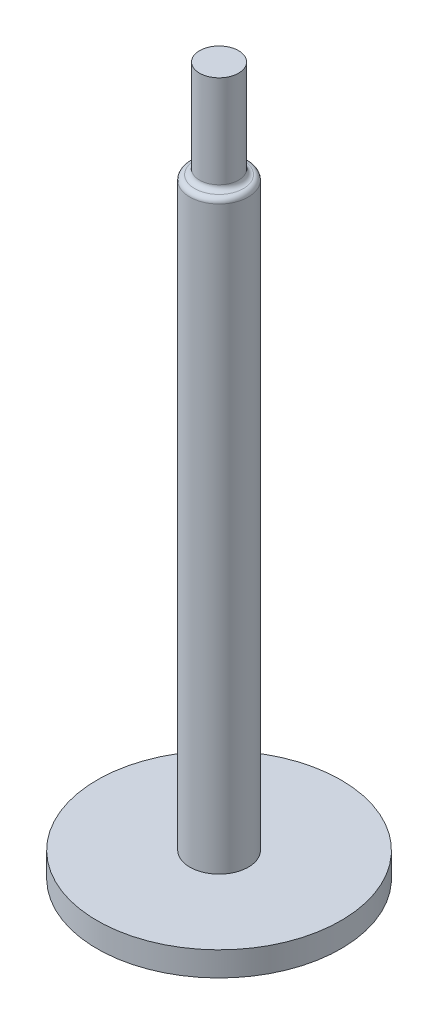
ISO-10303-21;
HEADER;
FILE_DESCRIPTION(('STEP AP214'),'2;1');
FILE_NAME('part.step','',(''),(''),'','','');
FILE_SCHEMA(('AUTOMOTIVE_DESIGN { 1 0 10303 214 1 1 1 1 }'));
ENDSEC;
DATA;
#1=APPLICATION_CONTEXT('core data for automotive mechanical design processes');
#2=APPLICATION_PROTOCOL_DEFINITION('international standard','automotive_design',2000,#1);
#3=PRODUCT_CONTEXT('',#1,'mechanical');
#4=PRODUCT('Part','Part','',(#3));
#5=PRODUCT_RELATED_PRODUCT_CATEGORY('part','',(#4));
#6=PRODUCT_DEFINITION_FORMATION('','',#4);
#7=PRODUCT_DEFINITION_CONTEXT('part definition',#1,'design');
#8=PRODUCT_DEFINITION('design','',#6,#7);
#9=PRODUCT_DEFINITION_SHAPE('','',#8);
#10=(LENGTH_UNIT() NAMED_UNIT(*) SI_UNIT(.MILLI.,.METRE.));
#11=(NAMED_UNIT(*) PLANE_ANGLE_UNIT() SI_UNIT($,.RADIAN.));
#12=(NAMED_UNIT(*) SI_UNIT($,.STERADIAN.) SOLID_ANGLE_UNIT());
#13=UNCERTAINTY_MEASURE_WITH_UNIT(LENGTH_MEASURE(1.E-05),#10,'distance_accuracy_value','');
#14=(GEOMETRIC_REPRESENTATION_CONTEXT(3) GLOBAL_UNCERTAINTY_ASSIGNED_CONTEXT((#13)) GLOBAL_UNIT_ASSIGNED_CONTEXT((#10,
#11,#12)) REPRESENTATION_CONTEXT('',''));
#15=CARTESIAN_POINT('',(0.,0.,0.));
#16=DIRECTION('',(0.,0.,1.));
#17=DIRECTION('',(1.,0.,0.));
#18=AXIS2_PLACEMENT_3D('',#15,#16,#17);
#19=CARTESIAN_POINT('',(0.,10.,0.));
#20=DIRECTION('',(0.,-1.,0.));
#21=DIRECTION('',(0.,0.,-1.));
#22=AXIS2_PLACEMENT_3D('',#19,#20,#21);
#23=CYLINDRICAL_SURFACE('',#22,4.);
#24=CARTESIAN_POINT('',(0.,-9.,0.));
#25=DIRECTION('',(0.,-1.,0.));
#26=DIRECTION('',(0.,0.,-1.));
#27=AXIS2_PLACEMENT_3D('',#24,#25,#26);
#28=CIRCLE('',#27,4.);
#29=CARTESIAN_POINT('',(0.,-9.,-4.));
#30=VERTEX_POINT('',#29);
#31=EDGE_CURVE('E44',#30,#30,#28,.F.);
#32=ORIENTED_EDGE('',*,*,#31,.T.);
#33=EDGE_LOOP('',(#32));
#34=FACE_BOUND('',#33,.T.);
#35=CARTESIAN_POINT('',(0.,10.,0.));
#36=DIRECTION('',(0.,1.,0.));
#37=DIRECTION('',(0.,0.,1.));
#38=AXIS2_PLACEMENT_3D('',#35,#36,#37);
#39=CIRCLE('',#38,4.);
#40=CARTESIAN_POINT('',(0.,10.,4.));
#41=VERTEX_POINT('',#40);
#42=EDGE_CURVE('E51',#41,#41,#39,.T.);
#43=ORIENTED_EDGE('',*,*,#42,.F.);
#44=EDGE_LOOP('',(#43));
#45=FACE_BOUND('',#44,.T.);
#46=ADVANCED_FACE('F36',(#34,#45),#23,.T.);
#47=CARTESIAN_POINT('',(0.,10.,0.));
#48=DIRECTION('',(0.,1.,0.));
#49=DIRECTION('',(0.,0.,1.));
#50=AXIS2_PLACEMENT_3D('',#47,#48,#49);
#51=PLANE('',#50);
#52=ORIENTED_EDGE('',*,*,#42,.T.);
#53=EDGE_LOOP('',(#52));
#54=FACE_BOUND('',#53,.T.);
#55=ADVANCED_FACE('F85',(#54),#51,.T.);
#56=CARTESIAN_POINT('',(0.,-130.,0.));
#57=DIRECTION('',(0.,1.,0.));
#58=DIRECTION('',(0.,0.,1.));
#59=AXIS2_PLACEMENT_3D('',#56,#57,#58);
#60=CYLINDRICAL_SURFACE('',#59,6.);
#61=CARTESIAN_POINT('',(0.,-11.,0.));
#62=DIRECTION('',(0.,-1.,0.));
#63=DIRECTION('',(0.,0.,-1.));
#64=AXIS2_PLACEMENT_3D('',#61,#62,#63);
#65=CIRCLE('',#64,6.);
#66=CARTESIAN_POINT('',(0.,-11.,-6.));
#67=VERTEX_POINT('',#66);
#68=EDGE_CURVE('E10',#67,#67,#65,.T.);
#69=ORIENTED_EDGE('',*,*,#68,.T.);
#70=EDGE_LOOP('',(#69));
#71=FACE_BOUND('',#70,.T.);
#72=CARTESIAN_POINT('',(0.,-130.,0.));
#73=DIRECTION('',(0.,-1.,0.));
#74=DIRECTION('',(0.,0.,-1.));
#75=AXIS2_PLACEMENT_3D('',#72,#73,#74);
#76=CIRCLE('',#75,6.);
#77=CARTESIAN_POINT('',(0.,-130.,-6.));
#78=VERTEX_POINT('',#77);
#79=EDGE_CURVE('E54',#78,#78,#76,.T.);
#80=ORIENTED_EDGE('',*,*,#79,.F.);
#81=EDGE_LOOP('',(#80));
#82=FACE_BOUND('',#81,.T.);
#83=ADVANCED_FACE('F91',(#71,#82),#60,.T.);
#84=CARTESIAN_POINT('',(0.,-135.,0.));
#85=DIRECTION('',(0.,1.,0.));
#86=DIRECTION('',(0.,0.,1.));
#87=AXIS2_PLACEMENT_3D('',#84,#85,#86);
#88=CYLINDRICAL_SURFACE('',#87,25.);
#89=CARTESIAN_POINT('',(0.,-135.,0.));
#90=DIRECTION('',(0.,-1.,0.));
#91=DIRECTION('',(0.,0.,-1.));
#92=AXIS2_PLACEMENT_3D('',#89,#90,#91);
#93=CIRCLE('',#92,25.);
#94=CARTESIAN_POINT('',(0.,-135.,-25.));
#95=VERTEX_POINT('',#94);
#96=EDGE_CURVE('E57',#95,#95,#93,.T.);
#97=ORIENTED_EDGE('',*,*,#96,.F.);
#98=EDGE_LOOP('',(#97));
#99=FACE_BOUND('',#98,.T.);
#100=CARTESIAN_POINT('',(0.,-130.,0.));
#101=DIRECTION('',(0.,-1.,0.));
#102=DIRECTION('',(0.,0.,-1.));
#103=AXIS2_PLACEMENT_3D('',#100,#101,#102);
#104=CIRCLE('',#103,25.);
#105=CARTESIAN_POINT('',(0.,-130.,-25.));
#106=VERTEX_POINT('',#105);
#107=EDGE_CURVE('E58',#106,#106,#104,.T.);
#108=ORIENTED_EDGE('',*,*,#107,.T.);
#109=EDGE_LOOP('',(#108));
#110=FACE_BOUND('',#109,.T.);
#111=ADVANCED_FACE('F98',(#99,#110),#88,.T.);
#112=CARTESIAN_POINT('',(0.,-135.,0.));
#113=DIRECTION('',(0.,-1.,0.));
#114=DIRECTION('',(0.,0.,-1.));
#115=AXIS2_PLACEMENT_3D('',#112,#113,#114);
#116=PLANE('',#115);
#117=CARTESIAN_POINT('',(0.,-135.,0.));
#118=DIRECTION('',(0.,-1.,0.));
#119=DIRECTION('',(0.,0.,-1.));
#120=AXIS2_PLACEMENT_3D('',#117,#118,#119);
#121=CIRCLE('',#120,6.);
#122=CARTESIAN_POINT('',(0.,-135.,-6.));
#123=VERTEX_POINT('',#122);
#124=EDGE_CURVE('E48',#123,#123,#121,.T.);
#125=ORIENTED_EDGE('',*,*,#124,.F.);
#126=EDGE_LOOP('',(#125));
#127=FACE_BOUND('',#126,.T.);
#128=ORIENTED_EDGE('',*,*,#96,.T.);
#129=EDGE_LOOP('',(#128));
#130=FACE_BOUND('',#129,.T.);
#131=ADVANCED_FACE('F101',(#127,#130),#116,.T.);
#132=CARTESIAN_POINT('',(0.,-130.,0.));
#133=DIRECTION('',(0.,-1.,0.));
#134=DIRECTION('',(0.,0.,-1.));
#135=AXIS2_PLACEMENT_3D('',#132,#133,#134);
#136=PLANE('',#135);
#137=ORIENTED_EDGE('',*,*,#79,.T.);
#138=EDGE_LOOP('',(#137));
#139=FACE_BOUND('',#138,.T.);
#140=ORIENTED_EDGE('',*,*,#107,.F.);
#141=EDGE_LOOP('',(#140));
#142=FACE_BOUND('',#141,.T.);
#143=ADVANCED_FACE('F103',(#139,#142),#136,.F.);
#144=CARTESIAN_POINT('',(0.,-140.,0.));
#145=DIRECTION('',(0.,1.,0.));
#146=DIRECTION('',(0.,0.,1.));
#147=AXIS2_PLACEMENT_3D('',#144,#145,#146);
#148=CYLINDRICAL_SURFACE('',#147,6.);
#149=CARTESIAN_POINT('',(0.,-140.,0.));
#150=DIRECTION('',(0.,-1.,0.));
#151=DIRECTION('',(0.,0.,-1.));
#152=AXIS2_PLACEMENT_3D('',#149,#150,#151);
#153=CIRCLE('',#152,6.);
#154=CARTESIAN_POINT('',(0.,-140.,-6.));
#155=VERTEX_POINT('',#154);
#156=EDGE_CURVE('E61',#155,#155,#153,.T.);
#157=ORIENTED_EDGE('',*,*,#156,.F.);
#158=EDGE_LOOP('',(#157));
#159=FACE_BOUND('',#158,.T.);
#160=ORIENTED_EDGE('',*,*,#124,.T.);
#161=EDGE_LOOP('',(#160));
#162=FACE_BOUND('',#161,.T.);
#163=ADVANCED_FACE('F82',(#159,#162),#148,.T.);
#164=CARTESIAN_POINT('',(0.,-140.,0.));
#165=DIRECTION('',(0.,-1.,0.));
#166=DIRECTION('',(0.,0.,-1.));
#167=AXIS2_PLACEMENT_3D('',#164,#165,#166);
#168=PLANE('',#167);
#169=ORIENTED_EDGE('',*,*,#156,.T.);
#170=EDGE_LOOP('',(#169));
#171=FACE_BOUND('',#170,.T.);
#172=ADVANCED_FACE('F76',(#171),#168,.T.);
#173=CARTESIAN_POINT('',(0.,-11.,0.));
#174=DIRECTION('',(0.,-1.,0.));
#175=DIRECTION('',(0.,0.,-1.));
#176=AXIS2_PLACEMENT_3D('',#173,#174,#175);
#177=TOROIDAL_SURFACE('',#176,5.,1.);
#178=ORIENTED_EDGE('',*,*,#68,.F.);
#179=EDGE_LOOP('',(#178));
#180=FACE_BOUND('',#179,.T.);
#181=CARTESIAN_POINT('',(0.,-10.,0.));
#182=DIRECTION('',(0.,-1.,0.));
#183=DIRECTION('',(0.,0.,-1.));
#184=AXIS2_PLACEMENT_3D('',#181,#182,#183);
#185=CIRCLE('',#184,5.);
#186=CARTESIAN_POINT('',(0.,-10.,-5.));
#187=VERTEX_POINT('',#186);
#188=EDGE_CURVE('E40',#187,#187,#185,.F.);
#189=ORIENTED_EDGE('',*,*,#188,.F.);
#190=EDGE_LOOP('',(#189));
#191=FACE_BOUND('',#190,.T.);
#192=ADVANCED_FACE('F38',(#180,#191),#177,.T.);
#193=CARTESIAN_POINT('',(0.,-9.,0.));
#194=DIRECTION('',(0.,-1.,0.));
#195=DIRECTION('',(0.,0.,-1.));
#196=AXIS2_PLACEMENT_3D('',#193,#194,#195);
#197=TOROIDAL_SURFACE('',#196,5.,1.);
#198=ORIENTED_EDGE('',*,*,#188,.T.);
#199=EDGE_LOOP('',(#198));
#200=FACE_BOUND('',#199,.T.);
#201=ORIENTED_EDGE('',*,*,#31,.F.);
#202=EDGE_LOOP('',(#201));
#203=FACE_BOUND('',#202,.T.);
#204=ADVANCED_FACE('F72',(#200,#203),#197,.F.);
#205=CLOSED_SHELL('',(#46,#55,#83,#111,#131,#143,#163,#172,#192,#204));
#206=MANIFOLD_SOLID_BREP('B2',#205);
#207=ADVANCED_BREP_SHAPE_REPRESENTATION('',(#18,#206),#14);
#208=SHAPE_DEFINITION_REPRESENTATION(#9,#207);
ENDSEC;
END-ISO-10303-21;
